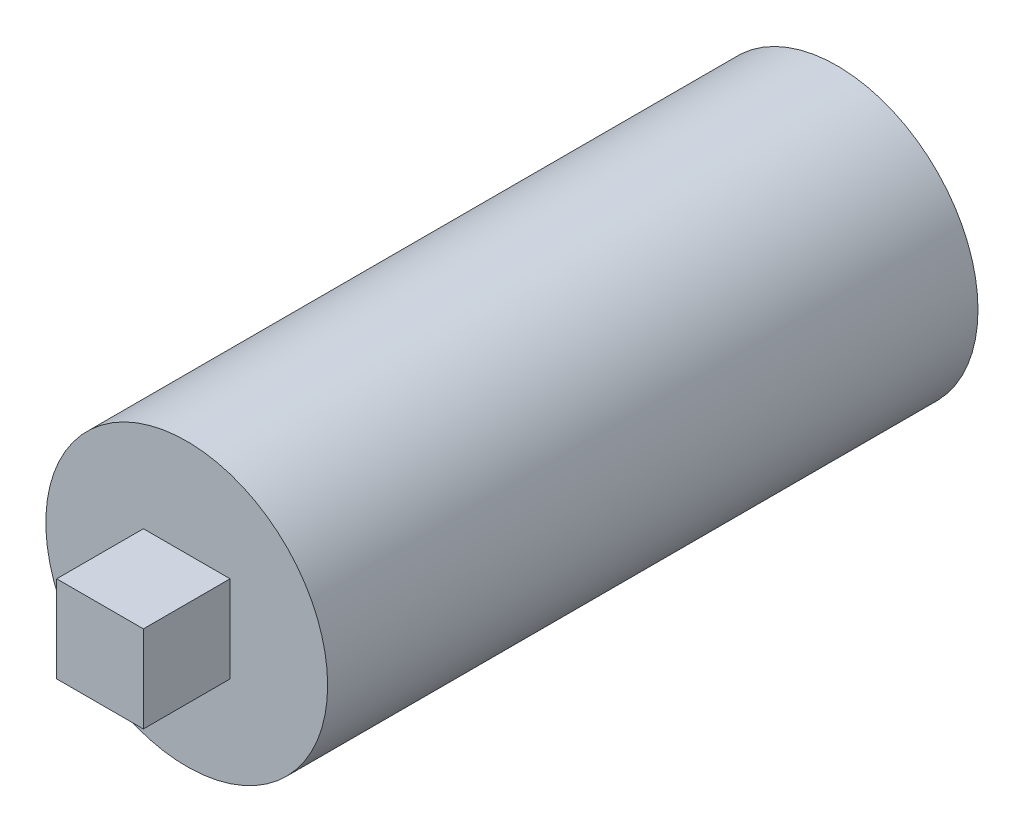
ISO-10303-21;
HEADER;
FILE_DESCRIPTION(('STEP AP214'),'2;1');
FILE_NAME('part.step','',(''),(''),'','','');
FILE_SCHEMA(('AUTOMOTIVE_DESIGN { 1 0 10303 214 1 1 1 1 }'));
ENDSEC;
DATA;
#1=APPLICATION_CONTEXT('core data for automotive mechanical design processes');
#2=APPLICATION_PROTOCOL_DEFINITION('international standard','automotive_design',2000,#1);
#3=PRODUCT_CONTEXT('',#1,'mechanical');
#4=PRODUCT('Part','Part','',(#3));
#5=PRODUCT_RELATED_PRODUCT_CATEGORY('part','',(#4));
#6=PRODUCT_DEFINITION_FORMATION('','',#4);
#7=PRODUCT_DEFINITION_CONTEXT('part definition',#1,'design');
#8=PRODUCT_DEFINITION('design','',#6,#7);
#9=PRODUCT_DEFINITION_SHAPE('','',#8);
#10=(LENGTH_UNIT() NAMED_UNIT(*) SI_UNIT(.MILLI.,.METRE.));
#11=(NAMED_UNIT(*) PLANE_ANGLE_UNIT() SI_UNIT($,.RADIAN.));
#12=(NAMED_UNIT(*) SI_UNIT($,.STERADIAN.) SOLID_ANGLE_UNIT());
#13=UNCERTAINTY_MEASURE_WITH_UNIT(LENGTH_MEASURE(1.E-05),#10,'distance_accuracy_value','');
#14=(GEOMETRIC_REPRESENTATION_CONTEXT(3) GLOBAL_UNCERTAINTY_ASSIGNED_CONTEXT((#13)) GLOBAL_UNIT_ASSIGNED_CONTEXT((#10,
#11,#12)) REPRESENTATION_CONTEXT('',''));
#15=CARTESIAN_POINT('',(0.,0.,0.));
#16=DIRECTION('',(0.,0.,1.));
#17=DIRECTION('',(1.,0.,0.));
#18=AXIS2_PLACEMENT_3D('',#15,#16,#17);
#19=CARTESIAN_POINT('',(0.,0.,150.));
#20=DIRECTION('',(0.,0.,1.));
#21=DIRECTION('',(1.,0.,0.));
#22=AXIS2_PLACEMENT_3D('',#19,#20,#21);
#23=PLANE('',#22);
#24=CARTESIAN_POINT('',(0.,0.,150.));
#25=DIRECTION('',(0.,0.,1.));
#26=DIRECTION('',(1.,0.,0.));
#27=AXIS2_PLACEMENT_3D('',#24,#25,#26);
#28=CIRCLE('',#27,32.5);
#29=CARTESIAN_POINT('',(32.5,0.,150.));
#30=VERTEX_POINT('',#29);
#31=EDGE_CURVE('E11',#30,#30,#28,.T.);
#32=ORIENTED_EDGE('',*,*,#31,.T.);
#33=EDGE_LOOP('',(#32));
#34=FACE_BOUND('',#33,.T.);
#35=DIRECTION('',(1.,0.,0.));
#36=VECTOR('',#35,1.);
#37=CARTESIAN_POINT('',(0.,10.,150.));
#38=LINE('',#37,#36);
#39=CARTESIAN_POINT('',(-10.,10.,150.));
#40=VERTEX_POINT('',#39);
#41=CARTESIAN_POINT('',(10.,10.,150.));
#42=VERTEX_POINT('',#41);
#43=EDGE_CURVE('E178',#40,#42,#38,.T.);
#44=ORIENTED_EDGE('',*,*,#43,.T.);
#45=DIRECTION('',(0.,-1.,0.));
#46=VECTOR('',#45,1.);
#47=CARTESIAN_POINT('',(10.,0.,150.));
#48=LINE('',#47,#46);
#49=CARTESIAN_POINT('',(10.,-10.,150.));
#50=VERTEX_POINT('',#49);
#51=EDGE_CURVE('E68',#42,#50,#48,.T.);
#52=ORIENTED_EDGE('',*,*,#51,.T.);
#53=DIRECTION('',(1.,0.,0.));
#54=VECTOR('',#53,1.);
#55=CARTESIAN_POINT('',(0.,-10.,150.));
#56=LINE('',#55,#54);
#57=CARTESIAN_POINT('',(-10.,-10.,150.));
#58=VERTEX_POINT('',#57);
#59=EDGE_CURVE('E165',#58,#50,#56,.T.);
#60=ORIENTED_EDGE('',*,*,#59,.F.);
#61=DIRECTION('',(0.,-1.,0.));
#62=VECTOR('',#61,1.);
#63=CARTESIAN_POINT('',(-10.,0.,150.));
#64=LINE('',#63,#62);
#65=EDGE_CURVE('E182',#40,#58,#64,.T.);
#66=ORIENTED_EDGE('',*,*,#65,.F.);
#67=EDGE_LOOP('',(#44,#52,#60,#66));
#68=FACE_BOUND('',#67,.T.);
#69=ADVANCED_FACE('F44',(#34,#68),#23,.T.);
#70=CARTESIAN_POINT('',(0.,0.,150.));
#71=DIRECTION('',(0.,0.,-1.));
#72=DIRECTION('',(-1.,0.,0.));
#73=AXIS2_PLACEMENT_3D('',#70,#71,#72);
#74=CYLINDRICAL_SURFACE('',#73,32.5);
#75=ORIENTED_EDGE('',*,*,#31,.F.);
#76=EDGE_LOOP('',(#75));
#77=FACE_BOUND('',#76,.T.);
#78=CARTESIAN_POINT('',(0.,0.,0.));
#79=DIRECTION('',(0.,0.,1.));
#80=DIRECTION('',(1.,0.,0.));
#81=AXIS2_PLACEMENT_3D('',#78,#79,#80);
#82=CIRCLE('',#81,32.5);
#83=CARTESIAN_POINT('',(32.5,0.,0.));
#84=VERTEX_POINT('',#83);
#85=EDGE_CURVE('E48',#84,#84,#82,.T.);
#86=ORIENTED_EDGE('',*,*,#85,.T.);
#87=EDGE_LOOP('',(#86));
#88=FACE_BOUND('',#87,.T.);
#89=ADVANCED_FACE('F46',(#77,#88),#74,.T.);
#90=CARTESIAN_POINT('',(0.,0.,0.));
#91=DIRECTION('',(0.,0.,1.));
#92=DIRECTION('',(1.,0.,0.));
#93=AXIS2_PLACEMENT_3D('',#90,#91,#92);
#94=PLANE('',#93);
#95=DIRECTION('',(-1.,0.,0.));
#96=VECTOR('',#95,1.);
#97=CARTESIAN_POINT('',(10.05,-9.81731054476747,0.));
#98=LINE('',#97,#96);
#99=CARTESIAN_POINT('',(10.05,-9.81731054476747,0.));
#100=VERTEX_POINT('',#99);
#101=CARTESIAN_POINT('',(-10.05,-9.81731054476747,0.));
#102=VERTEX_POINT('',#101);
#103=EDGE_CURVE('E146',#100,#102,#98,.T.);
#104=ORIENTED_EDGE('',*,*,#103,.F.);
#105=DIRECTION('',(0.,-1.,0.));
#106=VECTOR('',#105,1.);
#107=CARTESIAN_POINT('',(10.05,10.2826894552325,0.));
#108=LINE('',#107,#106);
#109=CARTESIAN_POINT('',(10.05,10.2826894552325,0.));
#110=VERTEX_POINT('',#109);
#111=EDGE_CURVE('E60',#110,#100,#108,.T.);
#112=ORIENTED_EDGE('',*,*,#111,.F.);
#113=DIRECTION('',(1.,0.,0.));
#114=VECTOR('',#113,1.);
#115=CARTESIAN_POINT('',(-10.05,10.2826894552324,0.));
#116=LINE('',#115,#114);
#117=CARTESIAN_POINT('',(-10.05,10.2826894552324,0.));
#118=VERTEX_POINT('',#117);
#119=EDGE_CURVE('E133',#118,#110,#116,.T.);
#120=ORIENTED_EDGE('',*,*,#119,.F.);
#121=DIRECTION('',(0.,1.,0.));
#122=VECTOR('',#121,1.);
#123=CARTESIAN_POINT('',(-10.05,-9.81731054476747,0.));
#124=LINE('',#123,#122);
#125=EDGE_CURVE('E137',#102,#118,#124,.T.);
#126=ORIENTED_EDGE('',*,*,#125,.F.);
#127=EDGE_LOOP('',(#104,#112,#120,#126));
#128=FACE_BOUND('',#127,.T.);
#129=ORIENTED_EDGE('',*,*,#85,.F.);
#130=EDGE_LOOP('',(#129));
#131=FACE_BOUND('',#130,.T.);
#132=ADVANCED_FACE('F206',(#128,#131),#94,.F.);
#133=CARTESIAN_POINT('',(10.,0.,170.));
#134=DIRECTION('',(1.,0.,0.));
#135=DIRECTION('',(0.,1.,0.));
#136=AXIS2_PLACEMENT_3D('',#133,#134,#135);
#137=PLANE('',#136);
#138=ORIENTED_EDGE('',*,*,#51,.F.);
#139=DIRECTION('',(0.,0.,-1.));
#140=VECTOR('',#139,1.);
#141=CARTESIAN_POINT('',(10.,10.,170.));
#142=LINE('',#141,#140);
#143=CARTESIAN_POINT('',(10.,10.,170.));
#144=VERTEX_POINT('',#143);
#145=EDGE_CURVE('E197',#144,#42,#142,.T.);
#146=ORIENTED_EDGE('',*,*,#145,.F.);
#147=DIRECTION('',(0.,-1.,0.));
#148=VECTOR('',#147,1.);
#149=CARTESIAN_POINT('',(10.,0.,170.));
#150=LINE('',#149,#148);
#151=CARTESIAN_POINT('',(10.,-10.,170.));
#152=VERTEX_POINT('',#151);
#153=EDGE_CURVE('E160',#144,#152,#150,.T.);
#154=ORIENTED_EDGE('',*,*,#153,.T.);
#155=DIRECTION('',(0.,0.,-1.));
#156=VECTOR('',#155,1.);
#157=CARTESIAN_POINT('',(10.,-10.,170.));
#158=LINE('',#157,#156);
#159=EDGE_CURVE('E175',#152,#50,#158,.T.);
#160=ORIENTED_EDGE('',*,*,#159,.T.);
#161=EDGE_LOOP('',(#138,#146,#154,#160));
#162=FACE_BOUND('',#161,.T.);
#163=ADVANCED_FACE('F208',(#162),#137,.T.);
#164=CARTESIAN_POINT('',(0.,10.,170.));
#165=DIRECTION('',(0.,1.,0.));
#166=DIRECTION('',(0.,0.,1.));
#167=AXIS2_PLACEMENT_3D('',#164,#165,#166);
#168=PLANE('',#167);
#169=ORIENTED_EDGE('',*,*,#43,.F.);
#170=DIRECTION('',(0.,0.,-1.));
#171=VECTOR('',#170,1.);
#172=CARTESIAN_POINT('',(-10.,10.,170.));
#173=LINE('',#172,#171);
#174=CARTESIAN_POINT('',(-10.,10.,170.));
#175=VERTEX_POINT('',#174);
#176=EDGE_CURVE('E194',#175,#40,#173,.T.);
#177=ORIENTED_EDGE('',*,*,#176,.F.);
#178=DIRECTION('',(1.,0.,0.));
#179=VECTOR('',#178,1.);
#180=CARTESIAN_POINT('',(0.,10.,170.));
#181=LINE('',#180,#179);
#182=EDGE_CURVE('E164',#175,#144,#181,.T.);
#183=ORIENTED_EDGE('',*,*,#182,.T.);
#184=ORIENTED_EDGE('',*,*,#145,.T.);
#185=EDGE_LOOP('',(#169,#177,#183,#184));
#186=FACE_BOUND('',#185,.T.);
#187=ADVANCED_FACE('F215',(#186),#168,.T.);
#188=CARTESIAN_POINT('',(-10.,0.,170.));
#189=DIRECTION('',(1.,0.,0.));
#190=DIRECTION('',(0.,1.,0.));
#191=AXIS2_PLACEMENT_3D('',#188,#189,#190);
#192=PLANE('',#191);
#193=ORIENTED_EDGE('',*,*,#65,.T.);
#194=DIRECTION('',(0.,0.,-1.));
#195=VECTOR('',#194,1.);
#196=CARTESIAN_POINT('',(-10.,-10.,170.));
#197=LINE('',#196,#195);
#198=CARTESIAN_POINT('',(-10.,-10.,170.));
#199=VERTEX_POINT('',#198);
#200=EDGE_CURVE('E190',#199,#58,#197,.T.);
#201=ORIENTED_EDGE('',*,*,#200,.F.);
#202=DIRECTION('',(0.,-1.,0.));
#203=VECTOR('',#202,1.);
#204=CARTESIAN_POINT('',(-10.,0.,170.));
#205=LINE('',#204,#203);
#206=EDGE_CURVE('E169',#175,#199,#205,.T.);
#207=ORIENTED_EDGE('',*,*,#206,.F.);
#208=ORIENTED_EDGE('',*,*,#176,.T.);
#209=EDGE_LOOP('',(#193,#201,#207,#208));
#210=FACE_BOUND('',#209,.T.);
#211=ADVANCED_FACE('F228',(#210),#192,.F.);
#212=CARTESIAN_POINT('',(0.,-10.,170.));
#213=DIRECTION('',(0.,1.,0.));
#214=DIRECTION('',(0.,0.,1.));
#215=AXIS2_PLACEMENT_3D('',#212,#213,#214);
#216=PLANE('',#215);
#217=ORIENTED_EDGE('',*,*,#59,.T.);
#218=ORIENTED_EDGE('',*,*,#159,.F.);
#219=DIRECTION('',(1.,0.,0.));
#220=VECTOR('',#219,1.);
#221=CARTESIAN_POINT('',(0.,-10.,170.));
#222=LINE('',#221,#220);
#223=EDGE_CURVE('E172',#199,#152,#222,.T.);
#224=ORIENTED_EDGE('',*,*,#223,.F.);
#225=ORIENTED_EDGE('',*,*,#200,.T.);
#226=EDGE_LOOP('',(#217,#218,#224,#225));
#227=FACE_BOUND('',#226,.T.);
#228=ADVANCED_FACE('F231',(#227),#216,.F.);
#229=CARTESIAN_POINT('',(0.,0.,170.));
#230=DIRECTION('',(0.,0.,1.));
#231=DIRECTION('',(1.,0.,0.));
#232=AXIS2_PLACEMENT_3D('',#229,#230,#231);
#233=PLANE('',#232);
#234=ORIENTED_EDGE('',*,*,#153,.F.);
#235=ORIENTED_EDGE('',*,*,#182,.F.);
#236=ORIENTED_EDGE('',*,*,#206,.T.);
#237=ORIENTED_EDGE('',*,*,#223,.T.);
#238=EDGE_LOOP('',(#234,#235,#236,#237));
#239=FACE_BOUND('',#238,.T.);
#240=ADVANCED_FACE('F235',(#239),#233,.T.);
#241=CARTESIAN_POINT('',(10.05,10.2826894552325,20.));
#242=DIRECTION('',(1.,0.,0.));
#243=DIRECTION('',(0.,1.,0.));
#244=AXIS2_PLACEMENT_3D('',#241,#242,#243);
#245=PLANE('',#244);
#246=ORIENTED_EDGE('',*,*,#111,.T.);
#247=DIRECTION('',(0.,0.,-1.));
#248=VECTOR('',#247,1.);
#249=CARTESIAN_POINT('',(10.05,-9.81731054476747,20.));
#250=LINE('',#249,#248);
#251=CARTESIAN_POINT('',(10.05,-9.81731054476747,20.));
#252=VERTEX_POINT('',#251);
#253=EDGE_CURVE('E108',#252,#100,#250,.T.);
#254=ORIENTED_EDGE('',*,*,#253,.F.);
#255=DIRECTION('',(0.,-1.,0.));
#256=VECTOR('',#255,1.);
#257=CARTESIAN_POINT('',(10.05,10.2826894552325,20.));
#258=LINE('',#257,#256);
#259=CARTESIAN_POINT('',(10.05,10.2826894552325,20.));
#260=VERTEX_POINT('',#259);
#261=EDGE_CURVE('E112',#260,#252,#258,.T.);
#262=ORIENTED_EDGE('',*,*,#261,.F.);
#263=DIRECTION('',(0.,0.,-1.));
#264=VECTOR('',#263,1.);
#265=CARTESIAN_POINT('',(10.05,10.2826894552325,20.));
#266=LINE('',#265,#264);
#267=EDGE_CURVE('E152',#260,#110,#266,.T.);
#268=ORIENTED_EDGE('',*,*,#267,.T.);
#269=EDGE_LOOP('',(#246,#254,#262,#268));
#270=FACE_BOUND('',#269,.T.);
#271=ADVANCED_FACE('F110',(#270),#245,.F.);
#272=CARTESIAN_POINT('',(-10.05,10.2826894552324,20.));
#273=DIRECTION('',(0.,1.,0.));
#274=DIRECTION('',(-1.,0.,0.));
#275=AXIS2_PLACEMENT_3D('',#272,#273,#274);
#276=PLANE('',#275);
#277=ORIENTED_EDGE('',*,*,#119,.T.);
#278=ORIENTED_EDGE('',*,*,#267,.F.);
#279=DIRECTION('',(1.,0.,0.));
#280=VECTOR('',#279,1.);
#281=CARTESIAN_POINT('',(-10.05,10.2826894552324,20.));
#282=LINE('',#281,#280);
#283=CARTESIAN_POINT('',(-10.05,10.2826894552324,20.));
#284=VERTEX_POINT('',#283);
#285=EDGE_CURVE('E119',#284,#260,#282,.T.);
#286=ORIENTED_EDGE('',*,*,#285,.F.);
#287=DIRECTION('',(0.,0.,-1.));
#288=VECTOR('',#287,1.);
#289=CARTESIAN_POINT('',(-10.05,10.2826894552324,20.));
#290=LINE('',#289,#288);
#291=EDGE_CURVE('E155',#284,#118,#290,.T.);
#292=ORIENTED_EDGE('',*,*,#291,.T.);
#293=EDGE_LOOP('',(#277,#278,#286,#292));
#294=FACE_BOUND('',#293,.T.);
#295=ADVANCED_FACE('F244',(#294),#276,.F.);
#296=CARTESIAN_POINT('',(-10.05,-9.81731054476747,20.));
#297=DIRECTION('',(-1.,0.,0.));
#298=DIRECTION('',(0.,0.,1.));
#299=AXIS2_PLACEMENT_3D('',#296,#297,#298);
#300=PLANE('',#299);
#301=ORIENTED_EDGE('',*,*,#125,.T.);
#302=ORIENTED_EDGE('',*,*,#291,.F.);
#303=DIRECTION('',(0.,1.,0.));
#304=VECTOR('',#303,1.);
#305=CARTESIAN_POINT('',(-10.05,-9.81731054476747,20.));
#306=LINE('',#305,#304);
#307=CARTESIAN_POINT('',(-10.05,-9.81731054476747,20.));
#308=VERTEX_POINT('',#307);
#309=EDGE_CURVE('E128',#308,#284,#306,.T.);
#310=ORIENTED_EDGE('',*,*,#309,.F.);
#311=DIRECTION('',(0.,0.,-1.));
#312=VECTOR('',#311,1.);
#313=CARTESIAN_POINT('',(-10.05,-9.81731054476747,20.));
#314=LINE('',#313,#312);
#315=EDGE_CURVE('E118',#308,#102,#314,.T.);
#316=ORIENTED_EDGE('',*,*,#315,.T.);
#317=EDGE_LOOP('',(#301,#302,#310,#316));
#318=FACE_BOUND('',#317,.T.);
#319=ADVANCED_FACE('F247',(#318),#300,.F.);
#320=CARTESIAN_POINT('',(10.05,-9.81731054476747,20.));
#321=DIRECTION('',(0.,-1.,0.));
#322=DIRECTION('',(0.,0.,-1.));
#323=AXIS2_PLACEMENT_3D('',#320,#321,#322);
#324=PLANE('',#323);
#325=ORIENTED_EDGE('',*,*,#103,.T.);
#326=ORIENTED_EDGE('',*,*,#315,.F.);
#327=DIRECTION('',(-1.,0.,0.));
#328=VECTOR('',#327,1.);
#329=CARTESIAN_POINT('',(10.05,-9.81731054476747,20.));
#330=LINE('',#329,#328);
#331=EDGE_CURVE('E122',#252,#308,#330,.T.);
#332=ORIENTED_EDGE('',*,*,#331,.F.);
#333=ORIENTED_EDGE('',*,*,#253,.T.);
#334=EDGE_LOOP('',(#325,#326,#332,#333));
#335=FACE_BOUND('',#334,.T.);
#336=ADVANCED_FACE('F123',(#335),#324,.F.);
#337=CARTESIAN_POINT('',(0.,0.,20.));
#338=DIRECTION('',(0.,0.,1.));
#339=DIRECTION('',(1.,0.,0.));
#340=AXIS2_PLACEMENT_3D('',#337,#338,#339);
#341=PLANE('',#340);
#342=ORIENTED_EDGE('',*,*,#261,.T.);
#343=ORIENTED_EDGE('',*,*,#331,.T.);
#344=ORIENTED_EDGE('',*,*,#309,.T.);
#345=ORIENTED_EDGE('',*,*,#285,.T.);
#346=EDGE_LOOP('',(#342,#343,#344,#345));
#347=FACE_BOUND('',#346,.T.);
#348=ADVANCED_FACE('F130',(#347),#341,.F.);
#349=CLOSED_SHELL('',(#69,#89,#132,#163,#187,#211,#228,#240,#271,#295,#319,#336,#348));
#350=MANIFOLD_SOLID_BREP('B2',#349);
#351=ADVANCED_BREP_SHAPE_REPRESENTATION('',(#18,#350),#14);
#352=SHAPE_DEFINITION_REPRESENTATION(#9,#351);
ENDSEC;
END-ISO-10303-21;
